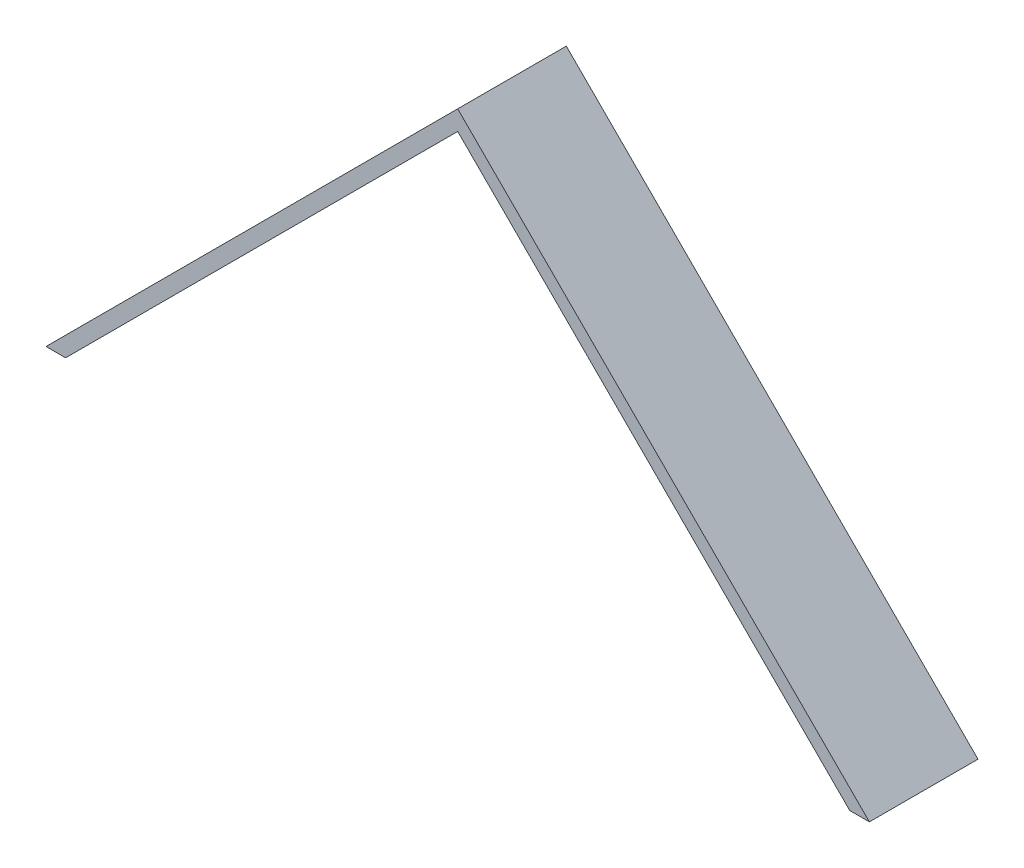
ISO-10303-21;
HEADER;
FILE_DESCRIPTION(('STEP AP214'),'2;1');
FILE_NAME('part.step','',(''),(''),'','','');
FILE_SCHEMA(('AUTOMOTIVE_DESIGN { 1 0 10303 214 1 1 1 1 }'));
ENDSEC;
DATA;
#1=APPLICATION_CONTEXT('core data for automotive mechanical design processes');
#2=APPLICATION_PROTOCOL_DEFINITION('international standard','automotive_design',2000,#1);
#3=PRODUCT_CONTEXT('',#1,'mechanical');
#4=PRODUCT('Part','Part','',(#3));
#5=PRODUCT_RELATED_PRODUCT_CATEGORY('part','',(#4));
#6=PRODUCT_DEFINITION_FORMATION('','',#4);
#7=PRODUCT_DEFINITION_CONTEXT('part definition',#1,'design');
#8=PRODUCT_DEFINITION('design','',#6,#7);
#9=PRODUCT_DEFINITION_SHAPE('','',#8);
#10=(LENGTH_UNIT() NAMED_UNIT(*) SI_UNIT(.MILLI.,.METRE.));
#11=(NAMED_UNIT(*) PLANE_ANGLE_UNIT() SI_UNIT($,.RADIAN.));
#12=(NAMED_UNIT(*) SI_UNIT($,.STERADIAN.) SOLID_ANGLE_UNIT());
#13=UNCERTAINTY_MEASURE_WITH_UNIT(LENGTH_MEASURE(1.E-05),#10,'distance_accuracy_value','');
#14=(GEOMETRIC_REPRESENTATION_CONTEXT(3) GLOBAL_UNCERTAINTY_ASSIGNED_CONTEXT((#13)) GLOBAL_UNIT_ASSIGNED_CONTEXT((#10,
#11,#12)) REPRESENTATION_CONTEXT('',''));
#15=CARTESIAN_POINT('',(0.,0.,0.));
#16=DIRECTION('',(0.,0.,1.));
#17=DIRECTION('',(1.,0.,0.));
#18=AXIS2_PLACEMENT_3D('',#15,#16,#17);
#19=CARTESIAN_POINT('',(0.,565.685424949237,149.225));
#20=DIRECTION('',(-0.707106781186546,-0.707106781186549,0.));
#21=DIRECTION('',(0.707106781186549,-0.707106781186546,0.));
#22=AXIS2_PLACEMENT_3D('',#19,#20,#21);
#23=PLANE('',#22);
#24=DIRECTION('',(-0.707106781186549,0.707106781186546,0.));
#25=VECTOR('',#24,1.);
#26=CARTESIAN_POINT('',(0.,565.685424949237,0.));
#27=LINE('',#26,#25);
#28=CARTESIAN_POINT('',(565.685424949239,0.,0.));
#29=VERTEX_POINT('',#28);
#30=CARTESIAN_POINT('',(0.,565.685424949237,0.));
#31=VERTEX_POINT('',#30);
#32=EDGE_CURVE('E116',#29,#31,#27,.T.);
#33=ORIENTED_EDGE('',*,*,#32,.T.);
#34=DIRECTION('',(0.,0.,-1.));
#35=VECTOR('',#34,1.);
#36=CARTESIAN_POINT('',(0.,565.685424949237,149.225));
#37=LINE('',#36,#35);
#38=CARTESIAN_POINT('',(0.,565.685424949237,149.225));
#39=VERTEX_POINT('',#38);
#40=EDGE_CURVE('E11',#39,#31,#37,.T.);
#41=ORIENTED_EDGE('',*,*,#40,.F.);
#42=DIRECTION('',(-0.707106781186549,0.707106781186546,0.));
#43=VECTOR('',#42,1.);
#44=CARTESIAN_POINT('',(0.,565.685424949237,149.225));
#45=LINE('',#44,#43);
#46=CARTESIAN_POINT('',(565.685424949239,0.,149.225));
#47=VERTEX_POINT('',#46);
#48=EDGE_CURVE('E126',#47,#39,#45,.T.);
#49=ORIENTED_EDGE('',*,*,#48,.F.);
#50=DIRECTION('',(0.,0.,-1.));
#51=VECTOR('',#50,1.);
#52=CARTESIAN_POINT('',(565.685424949239,0.,149.225));
#53=LINE('',#52,#51);
#54=EDGE_CURVE('E112',#47,#29,#53,.T.);
#55=ORIENTED_EDGE('',*,*,#54,.T.);
#56=EDGE_LOOP('',(#33,#41,#49,#55));
#57=FACE_BOUND('',#56,.T.);
#58=ADVANCED_FACE('F32',(#57),#23,.F.);
#59=CARTESIAN_POINT('',(0.,565.685424949237,149.225));
#60=DIRECTION('',(0.707106781186546,-0.707106781186549,0.));
#61=DIRECTION('',(0.707106781186549,0.707106781186546,0.));
#62=AXIS2_PLACEMENT_3D('',#59,#60,#61);
#63=PLANE('',#62);
#64=DIRECTION('',(-0.707106781186549,-0.707106781186546,0.));
#65=VECTOR('',#64,1.);
#66=CARTESIAN_POINT('',(0.,565.685424949237,0.));
#67=LINE('',#66,#65);
#68=CARTESIAN_POINT('',(-565.685424949239,0.,0.));
#69=VERTEX_POINT('',#68);
#70=EDGE_CURVE('E119',#31,#69,#67,.T.);
#71=ORIENTED_EDGE('',*,*,#70,.T.);
#72=DIRECTION('',(0.,0.,-1.));
#73=VECTOR('',#72,1.);
#74=CARTESIAN_POINT('',(-565.685424949239,0.,149.225));
#75=LINE('',#74,#73);
#76=CARTESIAN_POINT('',(-565.685424949239,0.,149.225));
#77=VERTEX_POINT('',#76);
#78=EDGE_CURVE('E40',#77,#69,#75,.T.);
#79=ORIENTED_EDGE('',*,*,#78,.F.);
#80=DIRECTION('',(-0.707106781186549,-0.707106781186546,0.));
#81=VECTOR('',#80,1.);
#82=CARTESIAN_POINT('',(0.,565.685424949237,149.225));
#83=LINE('',#82,#81);
#84=EDGE_CURVE('E85',#39,#77,#83,.T.);
#85=ORIENTED_EDGE('',*,*,#84,.F.);
#86=ORIENTED_EDGE('',*,*,#40,.T.);
#87=EDGE_LOOP('',(#71,#79,#85,#86));
#88=FACE_BOUND('',#87,.T.);
#89=ADVANCED_FACE('F150',(#88),#63,.F.);
#90=CARTESIAN_POINT('',(-565.685424949239,0.,149.225));
#91=DIRECTION('',(0.,1.,0.));
#92=DIRECTION('',(-1.,0.,0.));
#93=AXIS2_PLACEMENT_3D('',#90,#91,#92);
#94=PLANE('',#93);
#95=DIRECTION('',(1.,0.,0.));
#96=VECTOR('',#95,1.);
#97=CARTESIAN_POINT('',(-565.685424949239,0.,0.));
#98=LINE('',#97,#96);
#99=CARTESIAN_POINT('',(-538.744656586031,0.,0.));
#100=VERTEX_POINT('',#99);
#101=EDGE_CURVE('E121',#69,#100,#98,.T.);
#102=ORIENTED_EDGE('',*,*,#101,.T.);
#103=DIRECTION('',(0.,0.,-1.));
#104=VECTOR('',#103,1.);
#105=CARTESIAN_POINT('',(-538.744656586031,0.,149.225));
#106=LINE('',#105,#104);
#107=CARTESIAN_POINT('',(-538.744656586031,0.,149.225));
#108=VERTEX_POINT('',#107);
#109=EDGE_CURVE('E107',#108,#100,#106,.T.);
#110=ORIENTED_EDGE('',*,*,#109,.F.);
#111=DIRECTION('',(1.,0.,0.));
#112=VECTOR('',#111,1.);
#113=CARTESIAN_POINT('',(-565.685424949239,0.,149.225));
#114=LINE('',#113,#112);
#115=EDGE_CURVE('E98',#77,#108,#114,.T.);
#116=ORIENTED_EDGE('',*,*,#115,.F.);
#117=ORIENTED_EDGE('',*,*,#78,.T.);
#118=EDGE_LOOP('',(#102,#110,#116,#117));
#119=FACE_BOUND('',#118,.T.);
#120=ADVANCED_FACE('F132',(#119),#94,.F.);
#121=CARTESIAN_POINT('',(0.,538.74465658603,149.225));
#122=DIRECTION('',(-0.707106781186546,0.707106781186549,0.));
#123=DIRECTION('',(-0.707106781186549,-0.707106781186546,0.));
#124=AXIS2_PLACEMENT_3D('',#121,#122,#123);
#125=PLANE('',#124);
#126=DIRECTION('',(0.707106781186549,0.707106781186547,0.));
#127=VECTOR('',#126,1.);
#128=CARTESIAN_POINT('',(0.,538.74465658603,0.));
#129=LINE('',#128,#127);
#130=CARTESIAN_POINT('',(0.,538.74465658603,0.));
#131=VERTEX_POINT('',#130);
#132=EDGE_CURVE('E106',#100,#131,#129,.T.);
#133=ORIENTED_EDGE('',*,*,#132,.T.);
#134=DIRECTION('',(0.,0.,-1.));
#135=VECTOR('',#134,1.);
#136=CARTESIAN_POINT('',(0.,538.74465658603,149.225));
#137=LINE('',#136,#135);
#138=CARTESIAN_POINT('',(0.,538.74465658603,149.225));
#139=VERTEX_POINT('',#138);
#140=EDGE_CURVE('E103',#139,#131,#137,.T.);
#141=ORIENTED_EDGE('',*,*,#140,.F.);
#142=DIRECTION('',(0.707106781186549,0.707106781186547,0.));
#143=VECTOR('',#142,1.);
#144=CARTESIAN_POINT('',(0.,538.74465658603,149.225));
#145=LINE('',#144,#143);
#146=EDGE_CURVE('E92',#108,#139,#145,.T.);
#147=ORIENTED_EDGE('',*,*,#146,.F.);
#148=ORIENTED_EDGE('',*,*,#109,.T.);
#149=EDGE_LOOP('',(#133,#141,#147,#148));
#150=FACE_BOUND('',#149,.T.);
#151=ADVANCED_FACE('F104',(#150),#125,.F.);
#152=CARTESIAN_POINT('',(0.,538.74465658603,149.225));
#153=DIRECTION('',(0.707106781186546,0.707106781186549,0.));
#154=DIRECTION('',(-0.707106781186549,0.707106781186546,0.));
#155=AXIS2_PLACEMENT_3D('',#152,#153,#154);
#156=PLANE('',#155);
#157=DIRECTION('',(0.707106781186549,-0.707106781186546,0.));
#158=VECTOR('',#157,1.);
#159=CARTESIAN_POINT('',(0.,538.74465658603,0.));
#160=LINE('',#159,#158);
#161=CARTESIAN_POINT('',(538.744656586032,0.,0.));
#162=VERTEX_POINT('',#161);
#163=EDGE_CURVE('E71',#131,#162,#160,.T.);
#164=ORIENTED_EDGE('',*,*,#163,.T.);
#165=DIRECTION('',(0.,0.,-1.));
#166=VECTOR('',#165,1.);
#167=CARTESIAN_POINT('',(538.744656586032,0.,149.225));
#168=LINE('',#167,#166);
#169=CARTESIAN_POINT('',(538.744656586032,0.,149.225));
#170=VERTEX_POINT('',#169);
#171=EDGE_CURVE('E108',#170,#162,#168,.T.);
#172=ORIENTED_EDGE('',*,*,#171,.F.);
#173=DIRECTION('',(0.707106781186549,-0.707106781186546,0.));
#174=VECTOR('',#173,1.);
#175=CARTESIAN_POINT('',(0.,538.74465658603,149.225));
#176=LINE('',#175,#174);
#177=EDGE_CURVE('E96',#139,#170,#176,.T.);
#178=ORIENTED_EDGE('',*,*,#177,.F.);
#179=ORIENTED_EDGE('',*,*,#140,.T.);
#180=EDGE_LOOP('',(#164,#172,#178,#179));
#181=FACE_BOUND('',#180,.T.);
#182=ADVANCED_FACE('F110',(#181),#156,.F.);
#183=CARTESIAN_POINT('',(565.685424949239,0.,149.225));
#184=DIRECTION('',(0.,1.,0.));
#185=DIRECTION('',(-1.,0.,0.));
#186=AXIS2_PLACEMENT_3D('',#183,#184,#185);
#187=PLANE('',#186);
#188=DIRECTION('',(1.,0.,0.));
#189=VECTOR('',#188,1.);
#190=CARTESIAN_POINT('',(565.685424949239,0.,0.));
#191=LINE('',#190,#189);
#192=EDGE_CURVE('E77',#162,#29,#191,.T.);
#193=ORIENTED_EDGE('',*,*,#192,.T.);
#194=ORIENTED_EDGE('',*,*,#54,.F.);
#195=DIRECTION('',(1.,0.,0.));
#196=VECTOR('',#195,1.);
#197=CARTESIAN_POINT('',(565.685424949239,0.,149.225));
#198=LINE('',#197,#196);
#199=EDGE_CURVE('E48',#170,#47,#198,.T.);
#200=ORIENTED_EDGE('',*,*,#199,.F.);
#201=ORIENTED_EDGE('',*,*,#171,.T.);
#202=EDGE_LOOP('',(#193,#194,#200,#201));
#203=FACE_BOUND('',#202,.T.);
#204=ADVANCED_FACE('F139',(#203),#187,.F.);
#205=CARTESIAN_POINT('',(0.,0.,149.225));
#206=DIRECTION('',(0.,0.,-1.));
#207=DIRECTION('',(-1.,0.,0.));
#208=AXIS2_PLACEMENT_3D('',#205,#206,#207);
#209=PLANE('',#208);
#210=ORIENTED_EDGE('',*,*,#48,.T.);
#211=ORIENTED_EDGE('',*,*,#84,.T.);
#212=ORIENTED_EDGE('',*,*,#115,.T.);
#213=ORIENTED_EDGE('',*,*,#146,.T.);
#214=ORIENTED_EDGE('',*,*,#177,.T.);
#215=ORIENTED_EDGE('',*,*,#199,.T.);
#216=EDGE_LOOP('',(#210,#211,#212,#213,#214,#215));
#217=FACE_BOUND('',#216,.T.);
#218=ADVANCED_FACE('F94',(#217),#209,.F.);
#219=CARTESIAN_POINT('',(0.,0.,0.));
#220=DIRECTION('',(0.,0.,-1.));
#221=DIRECTION('',(-1.,0.,0.));
#222=AXIS2_PLACEMENT_3D('',#219,#220,#221);
#223=PLANE('',#222);
#224=ORIENTED_EDGE('',*,*,#32,.F.);
#225=ORIENTED_EDGE('',*,*,#192,.F.);
#226=ORIENTED_EDGE('',*,*,#163,.F.);
#227=ORIENTED_EDGE('',*,*,#132,.F.);
#228=ORIENTED_EDGE('',*,*,#101,.F.);
#229=ORIENTED_EDGE('',*,*,#70,.F.);
#230=EDGE_LOOP('',(#224,#225,#226,#227,#228,#229));
#231=FACE_BOUND('',#230,.T.);
#232=ADVANCED_FACE('F135',(#231),#223,.T.);
#233=CLOSED_SHELL('',(#58,#89,#120,#151,#182,#204,#218,#232));
#234=MANIFOLD_SOLID_BREP('B2',#233);
#235=ADVANCED_BREP_SHAPE_REPRESENTATION('',(#18,#234),#14);
#236=SHAPE_DEFINITION_REPRESENTATION(#9,#235);
ENDSEC;
END-ISO-10303-21;
